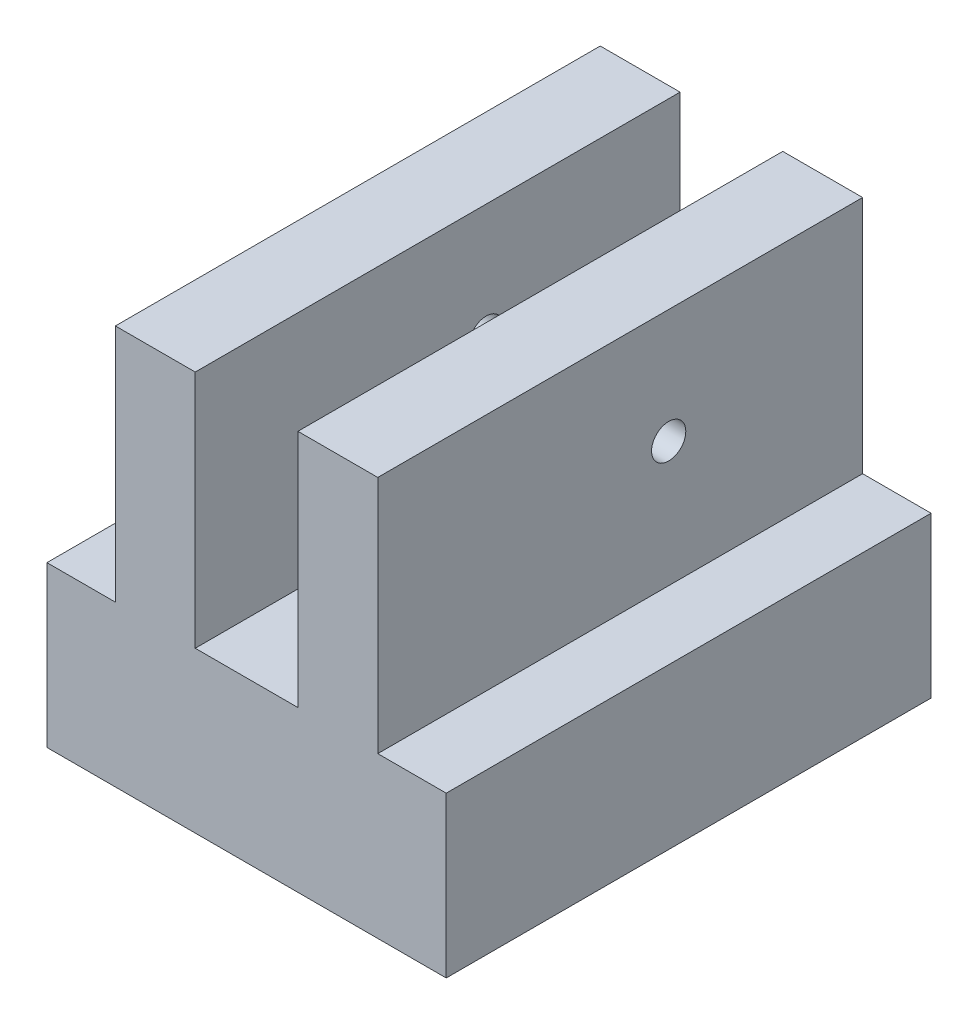
ISO-10303-21;
HEADER;
FILE_DESCRIPTION(('STEP AP214'),'2;1');
FILE_NAME('part.step','',(''),(''),'','','');
FILE_SCHEMA(('AUTOMOTIVE_DESIGN { 1 0 10303 214 1 1 1 1 }'));
ENDSEC;
DATA;
#1=APPLICATION_CONTEXT('core data for automotive mechanical design processes');
#2=APPLICATION_PROTOCOL_DEFINITION('international standard','automotive_design',2000,#1);
#3=PRODUCT_CONTEXT('',#1,'mechanical');
#4=PRODUCT('Part','Part','',(#3));
#5=PRODUCT_RELATED_PRODUCT_CATEGORY('part','',(#4));
#6=PRODUCT_DEFINITION_FORMATION('','',#4);
#7=PRODUCT_DEFINITION_CONTEXT('part definition',#1,'design');
#8=PRODUCT_DEFINITION('design','',#6,#7);
#9=PRODUCT_DEFINITION_SHAPE('','',#8);
#10=(LENGTH_UNIT() NAMED_UNIT(*) SI_UNIT(.MILLI.,.METRE.));
#11=(NAMED_UNIT(*) PLANE_ANGLE_UNIT() SI_UNIT($,.RADIAN.));
#12=(NAMED_UNIT(*) SI_UNIT($,.STERADIAN.) SOLID_ANGLE_UNIT());
#13=UNCERTAINTY_MEASURE_WITH_UNIT(LENGTH_MEASURE(1.E-05),#10,'distance_accuracy_value','');
#14=(GEOMETRIC_REPRESENTATION_CONTEXT(3) GLOBAL_UNCERTAINTY_ASSIGNED_CONTEXT((#13)) GLOBAL_UNIT_ASSIGNED_CONTEXT((#10,
#11,#12)) REPRESENTATION_CONTEXT('',''));
#15=CARTESIAN_POINT('',(0.,0.,0.));
#16=DIRECTION('',(0.,0.,1.));
#17=DIRECTION('',(1.,0.,0.));
#18=AXIS2_PLACEMENT_3D('',#15,#16,#17);
#19=CARTESIAN_POINT('',(0.,70.,0.));
#20=DIRECTION('',(0.,1.,0.));
#21=DIRECTION('',(0.,0.,1.));
#22=AXIS2_PLACEMENT_3D('',#19,#20,#21);
#23=PLANE('',#22);
#24=DIRECTION('',(0.,0.,1.));
#25=VECTOR('',#24,1.);
#26=CARTESIAN_POINT('',(-9.00000000000001,70.,0.));
#27=LINE('',#26,#25);
#28=CARTESIAN_POINT('',(-9.00000000000001,70.,-42.5));
#29=VERTEX_POINT('',#28);
#30=CARTESIAN_POINT('',(-9.00000000000001,70.,42.5));
#31=VERTEX_POINT('',#30);
#32=EDGE_CURVE('E157',#29,#31,#27,.T.);
#33=ORIENTED_EDGE('',*,*,#32,.F.);
#34=DIRECTION('',(-1.,0.,0.));
#35=VECTOR('',#34,1.);
#36=CARTESIAN_POINT('',(-35.,70.,-42.5));
#37=LINE('',#36,#35);
#38=CARTESIAN_POINT('',(-23.,70.,-42.5));
#39=VERTEX_POINT('',#38);
#40=EDGE_CURVE('E204',#29,#39,#37,.T.);
#41=ORIENTED_EDGE('',*,*,#40,.T.);
#42=DIRECTION('',(0.,0.,-1.));
#43=VECTOR('',#42,1.);
#44=CARTESIAN_POINT('',(-23.,70.,0.));
#45=LINE('',#44,#43);
#46=CARTESIAN_POINT('',(-23.,70.,42.5));
#47=VERTEX_POINT('',#46);
#48=EDGE_CURVE('E11',#47,#39,#45,.T.);
#49=ORIENTED_EDGE('',*,*,#48,.F.);
#50=DIRECTION('',(1.,0.,0.));
#51=VECTOR('',#50,1.);
#52=CARTESIAN_POINT('',(-35.,70.,42.5));
#53=LINE('',#52,#51);
#54=EDGE_CURVE('E205',#47,#31,#53,.T.);
#55=ORIENTED_EDGE('',*,*,#54,.T.);
#56=EDGE_LOOP('',(#33,#41,#49,#55));
#57=FACE_BOUND('',#56,.T.);
#58=ADVANCED_FACE('F33',(#57),#23,.T.);
#59=CARTESIAN_POINT('',(35.,50.,-8.49999999999999));
#60=DIRECTION('',(-1.,0.,0.));
#61=DIRECTION('',(0.,-1.,0.));
#62=AXIS2_PLACEMENT_3D('',#59,#60,#61);
#63=CYLINDRICAL_SURFACE('',#62,3.);
#64=CARTESIAN_POINT('',(-9.00000000000001,50.,-8.49999999999999));
#65=DIRECTION('',(-1.,0.,0.));
#66=DIRECTION('',(0.,-1.,0.));
#67=AXIS2_PLACEMENT_3D('',#64,#65,#66);
#68=CIRCLE('',#67,3.);
#69=CARTESIAN_POINT('',(-9.00000000000001,47.,-8.49999999999999));
#70=VERTEX_POINT('',#69);
#71=EDGE_CURVE('E37',#70,#70,#68,.F.);
#72=ORIENTED_EDGE('',*,*,#71,.T.);
#73=EDGE_LOOP('',(#72));
#74=FACE_BOUND('',#73,.T.);
#75=CARTESIAN_POINT('',(-23.,50.,-8.49999999999999));
#76=DIRECTION('',(-1.,0.,0.));
#77=DIRECTION('',(0.,-1.,0.));
#78=AXIS2_PLACEMENT_3D('',#75,#76,#77);
#79=CIRCLE('',#78,3.);
#80=CARTESIAN_POINT('',(-23.,47.,-8.49999999999999));
#81=VERTEX_POINT('',#80);
#82=EDGE_CURVE('E159',#81,#81,#79,.T.);
#83=ORIENTED_EDGE('',*,*,#82,.T.);
#84=EDGE_LOOP('',(#83));
#85=FACE_BOUND('',#84,.T.);
#86=ADVANCED_FACE('F244',(#74,#85),#63,.F.);
#87=CARTESIAN_POINT('',(35.,70.,-42.5));
#88=DIRECTION('',(-1.,0.,0.));
#89=DIRECTION('',(0.,0.,1.));
#90=AXIS2_PLACEMENT_3D('',#87,#88,#89);
#91=PLANE('',#90);
#92=DIRECTION('',(0.,-1.,0.));
#93=VECTOR('',#92,1.);
#94=CARTESIAN_POINT('',(35.,70.,-42.5));
#95=LINE('',#94,#93);
#96=CARTESIAN_POINT('',(35.,28.0642616694591,-42.5));
#97=VERTEX_POINT('',#96);
#98=CARTESIAN_POINT('',(35.,0.,-42.5));
#99=VERTEX_POINT('',#98);
#100=EDGE_CURVE('E225',#97,#99,#95,.T.);
#101=ORIENTED_EDGE('',*,*,#100,.F.);
#102=DIRECTION('',(0.,0.,1.));
#103=VECTOR('',#102,1.);
#104=CARTESIAN_POINT('',(35.,28.0642616694591,-42.5));
#105=LINE('',#104,#103);
#106=CARTESIAN_POINT('',(35.,28.0642616694591,42.5));
#107=VERTEX_POINT('',#106);
#108=EDGE_CURVE('E191',#97,#107,#105,.T.);
#109=ORIENTED_EDGE('',*,*,#108,.T.);
#110=DIRECTION('',(0.,-1.,0.));
#111=VECTOR('',#110,1.);
#112=CARTESIAN_POINT('',(35.,70.,42.5));
#113=LINE('',#112,#111);
#114=CARTESIAN_POINT('',(35.,0.,42.5));
#115=VERTEX_POINT('',#114);
#116=EDGE_CURVE('E208',#107,#115,#113,.T.);
#117=ORIENTED_EDGE('',*,*,#116,.T.);
#118=DIRECTION('',(0.,0.,-1.));
#119=VECTOR('',#118,1.);
#120=CARTESIAN_POINT('',(35.,0.,-42.5));
#121=LINE('',#120,#119);
#122=EDGE_CURVE('E198',#115,#99,#121,.T.);
#123=ORIENTED_EDGE('',*,*,#122,.T.);
#124=EDGE_LOOP('',(#101,#109,#117,#123));
#125=FACE_BOUND('',#124,.T.);
#126=ADVANCED_FACE('F35',(#125),#91,.F.);
#127=CARTESIAN_POINT('',(-35.,70.,-42.5));
#128=DIRECTION('',(0.,0.,1.));
#129=DIRECTION('',(1.,0.,0.));
#130=AXIS2_PLACEMENT_3D('',#127,#128,#129);
#131=PLANE('',#130);
#132=ORIENTED_EDGE('',*,*,#40,.F.);
#133=DIRECTION('',(0.,1.,0.));
#134=VECTOR('',#133,1.);
#135=CARTESIAN_POINT('',(-9.,90.8433065801214,-42.5));
#136=LINE('',#135,#134);
#137=CARTESIAN_POINT('',(-9.00000000000001,28.0642616694591,-42.5));
#138=VERTEX_POINT('',#137);
#139=EDGE_CURVE('E149',#138,#29,#136,.T.);
#140=ORIENTED_EDGE('',*,*,#139,.F.);
#141=DIRECTION('',(-1.,0.,0.));
#142=VECTOR('',#141,1.);
#143=CARTESIAN_POINT('',(8.99999999999999,28.0642616694591,-42.5));
#144=LINE('',#143,#142);
#145=CARTESIAN_POINT('',(8.99999999999999,28.0642616694591,-42.5));
#146=VERTEX_POINT('',#145);
#147=EDGE_CURVE('E146',#146,#138,#144,.T.);
#148=ORIENTED_EDGE('',*,*,#147,.F.);
#149=DIRECTION('',(0.,-1.,0.));
#150=VECTOR('',#149,1.);
#151=CARTESIAN_POINT('',(9.,90.8433065801214,-42.5));
#152=LINE('',#151,#150);
#153=CARTESIAN_POINT('',(8.99999999999999,70.,-42.5));
#154=VERTEX_POINT('',#153);
#155=EDGE_CURVE('E127',#154,#146,#152,.T.);
#156=ORIENTED_EDGE('',*,*,#155,.F.);
#157=CARTESIAN_POINT('',(23.,70.,-42.5));
#158=VERTEX_POINT('',#157);
#159=EDGE_CURVE('E201',#158,#154,#37,.T.);
#160=ORIENTED_EDGE('',*,*,#159,.F.);
#161=DIRECTION('',(0.,1.,0.));
#162=VECTOR('',#161,1.);
#163=CARTESIAN_POINT('',(23.,73.3710991092534,-42.5));
#164=LINE('',#163,#162);
#165=CARTESIAN_POINT('',(23.,28.0642616694591,-42.5));
#166=VERTEX_POINT('',#165);
#167=EDGE_CURVE('E184',#166,#158,#164,.T.);
#168=ORIENTED_EDGE('',*,*,#167,.F.);
#169=DIRECTION('',(-1.,0.,0.));
#170=VECTOR('',#169,1.);
#171=CARTESIAN_POINT('',(47.7491094384779,28.0642616694591,-42.5));
#172=LINE('',#171,#170);
#173=EDGE_CURVE('E179',#97,#166,#172,.T.);
#174=ORIENTED_EDGE('',*,*,#173,.F.);
#175=ORIENTED_EDGE('',*,*,#100,.T.);
#176=DIRECTION('',(-1.,0.,0.));
#177=VECTOR('',#176,1.);
#178=CARTESIAN_POINT('',(-35.,0.,-42.5));
#179=LINE('',#178,#177);
#180=CARTESIAN_POINT('',(-35.,0.,-42.5));
#181=VERTEX_POINT('',#180);
#182=EDGE_CURVE('E211',#99,#181,#179,.T.);
#183=ORIENTED_EDGE('',*,*,#182,.T.);
#184=DIRECTION('',(0.,-1.,0.));
#185=VECTOR('',#184,1.);
#186=CARTESIAN_POINT('',(-35.,70.,-42.5));
#187=LINE('',#186,#185);
#188=CARTESIAN_POINT('',(-35.,28.0642616694591,-42.5));
#189=VERTEX_POINT('',#188);
#190=EDGE_CURVE('E223',#189,#181,#187,.T.);
#191=ORIENTED_EDGE('',*,*,#190,.F.);
#192=DIRECTION('',(-1.,0.,0.));
#193=VECTOR('',#192,1.);
#194=CARTESIAN_POINT('',(-47.7491094384779,28.0642616694591,-42.5));
#195=LINE('',#194,#193);
#196=CARTESIAN_POINT('',(-23.,28.0642616694591,-42.5));
#197=VERTEX_POINT('',#196);
#198=EDGE_CURVE('E168',#197,#189,#195,.T.);
#199=ORIENTED_EDGE('',*,*,#198,.F.);
#200=DIRECTION('',(0.,-1.,0.));
#201=VECTOR('',#200,1.);
#202=CARTESIAN_POINT('',(-23.,73.3710991092534,-42.5));
#203=LINE('',#202,#201);
#204=EDGE_CURVE('E165',#39,#197,#203,.T.);
#205=ORIENTED_EDGE('',*,*,#204,.F.);
#206=EDGE_LOOP('',(#132,#140,#148,#156,#160,#168,#174,#175,#183,#191,#199,#205));
#207=FACE_BOUND('',#206,.T.);
#208=ADVANCED_FACE('F273',(#207),#131,.F.);
#209=CARTESIAN_POINT('',(-35.,70.,-42.5));
#210=DIRECTION('',(1.,0.,0.));
#211=DIRECTION('',(0.,0.,-1.));
#212=AXIS2_PLACEMENT_3D('',#209,#210,#211);
#213=PLANE('',#212);
#214=DIRECTION('',(0.,-1.,0.));
#215=VECTOR('',#214,1.);
#216=CARTESIAN_POINT('',(-35.,70.,42.5));
#217=LINE('',#216,#215);
#218=CARTESIAN_POINT('',(-35.,28.0642616694591,42.5));
#219=VERTEX_POINT('',#218);
#220=CARTESIAN_POINT('',(-35.,0.,42.5));
#221=VERTEX_POINT('',#220);
#222=EDGE_CURVE('E221',#219,#221,#217,.T.);
#223=ORIENTED_EDGE('',*,*,#222,.F.);
#224=DIRECTION('',(0.,0.,-1.));
#225=VECTOR('',#224,1.);
#226=CARTESIAN_POINT('',(-35.,28.0642616694591,-42.5));
#227=LINE('',#226,#225);
#228=EDGE_CURVE('E176',#219,#189,#227,.T.);
#229=ORIENTED_EDGE('',*,*,#228,.T.);
#230=ORIENTED_EDGE('',*,*,#190,.T.);
#231=DIRECTION('',(0.,0.,1.));
#232=VECTOR('',#231,1.);
#233=CARTESIAN_POINT('',(-35.,0.,-42.5));
#234=LINE('',#233,#232);
#235=EDGE_CURVE('E214',#181,#221,#234,.T.);
#236=ORIENTED_EDGE('',*,*,#235,.T.);
#237=EDGE_LOOP('',(#223,#229,#230,#236));
#238=FACE_BOUND('',#237,.T.);
#239=ADVANCED_FACE('F267',(#238),#213,.F.);
#240=CARTESIAN_POINT('',(-35.,70.,42.5));
#241=DIRECTION('',(0.,0.,-1.));
#242=DIRECTION('',(-1.,0.,0.));
#243=AXIS2_PLACEMENT_3D('',#240,#241,#242);
#244=PLANE('',#243);
#245=DIRECTION('',(-1.,0.,0.));
#246=VECTOR('',#245,1.);
#247=CARTESIAN_POINT('',(8.99999999999999,28.0642616694591,42.5));
#248=LINE('',#247,#246);
#249=CARTESIAN_POINT('',(8.99999999999999,28.0642616694591,42.5));
#250=VERTEX_POINT('',#249);
#251=CARTESIAN_POINT('',(-9.00000000000001,28.0642616694591,42.5));
#252=VERTEX_POINT('',#251);
#253=EDGE_CURVE('E132',#250,#252,#248,.T.);
#254=ORIENTED_EDGE('',*,*,#253,.T.);
#255=DIRECTION('',(0.,1.,0.));
#256=VECTOR('',#255,1.);
#257=CARTESIAN_POINT('',(-9.,90.8433065801214,42.5));
#258=LINE('',#257,#256);
#259=EDGE_CURVE('E144',#252,#31,#258,.T.);
#260=ORIENTED_EDGE('',*,*,#259,.T.);
#261=ORIENTED_EDGE('',*,*,#54,.F.);
#262=DIRECTION('',(0.,-1.,0.));
#263=VECTOR('',#262,1.);
#264=CARTESIAN_POINT('',(-23.,73.3710991092534,42.5));
#265=LINE('',#264,#263);
#266=CARTESIAN_POINT('',(-23.,28.0642616694591,42.5));
#267=VERTEX_POINT('',#266);
#268=EDGE_CURVE('E57',#47,#267,#265,.T.);
#269=ORIENTED_EDGE('',*,*,#268,.T.);
#270=DIRECTION('',(-1.,0.,0.));
#271=VECTOR('',#270,1.);
#272=CARTESIAN_POINT('',(-47.7491094384779,28.0642616694591,42.5));
#273=LINE('',#272,#271);
#274=EDGE_CURVE('E167',#267,#219,#273,.T.);
#275=ORIENTED_EDGE('',*,*,#274,.T.);
#276=ORIENTED_EDGE('',*,*,#222,.T.);
#277=DIRECTION('',(1.,0.,0.));
#278=VECTOR('',#277,1.);
#279=CARTESIAN_POINT('',(-35.,0.,42.5));
#280=LINE('',#279,#278);
#281=EDGE_CURVE('E217',#221,#115,#280,.T.);
#282=ORIENTED_EDGE('',*,*,#281,.T.);
#283=ORIENTED_EDGE('',*,*,#116,.F.);
#284=DIRECTION('',(-1.,0.,0.));
#285=VECTOR('',#284,1.);
#286=CARTESIAN_POINT('',(47.7491094384779,28.0642616694591,42.5));
#287=LINE('',#286,#285);
#288=CARTESIAN_POINT('',(23.,28.0642616694591,42.5));
#289=VERTEX_POINT('',#288);
#290=EDGE_CURVE('E180',#107,#289,#287,.T.);
#291=ORIENTED_EDGE('',*,*,#290,.T.);
#292=DIRECTION('',(0.,1.,0.));
#293=VECTOR('',#292,1.);
#294=CARTESIAN_POINT('',(23.,73.3710991092534,42.5));
#295=LINE('',#294,#293);
#296=CARTESIAN_POINT('',(23.,70.,42.5));
#297=VERTEX_POINT('',#296);
#298=EDGE_CURVE('E183',#289,#297,#295,.T.);
#299=ORIENTED_EDGE('',*,*,#298,.T.);
#300=CARTESIAN_POINT('',(8.99999999999999,70.,42.5));
#301=VERTEX_POINT('',#300);
#302=EDGE_CURVE('E143',#301,#297,#53,.T.);
#303=ORIENTED_EDGE('',*,*,#302,.F.);
#304=DIRECTION('',(0.,-1.,0.));
#305=VECTOR('',#304,1.);
#306=CARTESIAN_POINT('',(9.,90.8433065801214,42.5));
#307=LINE('',#306,#305);
#308=EDGE_CURVE('E50',#301,#250,#307,.T.);
#309=ORIENTED_EDGE('',*,*,#308,.T.);
#310=EDGE_LOOP('',(#254,#260,#261,#269,#275,#276,#282,#283,#291,#299,#303,#309));
#311=FACE_BOUND('',#310,.T.);
#312=ADVANCED_FACE('F141',(#311),#244,.F.);
#313=DIRECTION('',(0.,0.,-1.));
#314=VECTOR('',#313,1.);
#315=CARTESIAN_POINT('',(8.99999999999999,70.,0.));
#316=LINE('',#315,#314);
#317=EDGE_CURVE('E155',#301,#154,#316,.T.);
#318=ORIENTED_EDGE('',*,*,#317,.F.);
#319=ORIENTED_EDGE('',*,*,#302,.T.);
#320=DIRECTION('',(0.,0.,1.));
#321=VECTOR('',#320,1.);
#322=CARTESIAN_POINT('',(23.,70.,0.));
#323=LINE('',#322,#321);
#324=EDGE_CURVE('E42',#158,#297,#323,.T.);
#325=ORIENTED_EDGE('',*,*,#324,.F.);
#326=ORIENTED_EDGE('',*,*,#159,.T.);
#327=EDGE_LOOP('',(#318,#319,#325,#326));
#328=FACE_BOUND('',#327,.T.);
#329=ADVANCED_FACE('F247',(#328),#23,.T.);
#330=CARTESIAN_POINT('',(0.,0.,0.));
#331=DIRECTION('',(0.,1.,0.));
#332=DIRECTION('',(0.,0.,1.));
#333=AXIS2_PLACEMENT_3D('',#330,#331,#332);
#334=PLANE('',#333);
#335=CARTESIAN_POINT('',(0.,0.,0.));
#336=DIRECTION('',(0.,-1.,0.));
#337=DIRECTION('',(0.,0.,-1.));
#338=AXIS2_PLACEMENT_3D('',#335,#336,#337);
#339=CIRCLE('',#338,5.);
#340=CARTESIAN_POINT('',(0.,0.,-5.));
#341=VERTEX_POINT('',#340);
#342=EDGE_CURVE('E194',#341,#341,#339,.T.);
#343=ORIENTED_EDGE('',*,*,#342,.F.);
#344=EDGE_LOOP('',(#343));
#345=FACE_BOUND('',#344,.T.);
#346=ORIENTED_EDGE('',*,*,#122,.F.);
#347=ORIENTED_EDGE('',*,*,#281,.F.);
#348=ORIENTED_EDGE('',*,*,#235,.F.);
#349=ORIENTED_EDGE('',*,*,#182,.F.);
#350=EDGE_LOOP('',(#346,#347,#348,#349));
#351=FACE_BOUND('',#350,.T.);
#352=ADVANCED_FACE('F258',(#345,#351),#334,.F.);
#353=CARTESIAN_POINT('',(0.,20.,0.));
#354=DIRECTION('',(0.,-1.,0.));
#355=DIRECTION('',(0.,0.,-1.));
#356=AXIS2_PLACEMENT_3D('',#353,#354,#355);
#357=CYLINDRICAL_SURFACE('',#356,5.);
#358=CARTESIAN_POINT('',(0.,20.,0.));
#359=DIRECTION('',(0.,-1.,0.));
#360=DIRECTION('',(0.,0.,-1.));
#361=AXIS2_PLACEMENT_3D('',#358,#359,#360);
#362=CIRCLE('',#361,5.);
#363=CARTESIAN_POINT('',(0.,20.,-5.));
#364=VERTEX_POINT('',#363);
#365=EDGE_CURVE('E195',#364,#364,#362,.T.);
#366=ORIENTED_EDGE('',*,*,#365,.F.);
#367=EDGE_LOOP('',(#366));
#368=FACE_BOUND('',#367,.T.);
#369=ORIENTED_EDGE('',*,*,#342,.T.);
#370=EDGE_LOOP('',(#369));
#371=FACE_BOUND('',#370,.T.);
#372=ADVANCED_FACE('F265',(#368,#371),#357,.F.);
#373=CARTESIAN_POINT('',(0.,20.,0.));
#374=DIRECTION('',(0.,-1.,0.));
#375=DIRECTION('',(0.,0.,-1.));
#376=AXIS2_PLACEMENT_3D('',#373,#374,#375);
#377=PLANE('',#376);
#378=ORIENTED_EDGE('',*,*,#365,.T.);
#379=EDGE_LOOP('',(#378));
#380=FACE_BOUND('',#379,.T.);
#381=ADVANCED_FACE('F309',(#380),#377,.T.);
#382=CARTESIAN_POINT('',(47.7491094384779,28.0642616694591,42.5));
#383=DIRECTION('',(0.,-1.,0.));
#384=DIRECTION('',(0.,0.,-1.));
#385=AXIS2_PLACEMENT_3D('',#382,#383,#384);
#386=PLANE('',#385);
#387=ORIENTED_EDGE('',*,*,#173,.T.);
#388=DIRECTION('',(0.,0.,-1.));
#389=VECTOR('',#388,1.);
#390=CARTESIAN_POINT('',(23.,28.0642616694591,42.5));
#391=LINE('',#390,#389);
#392=EDGE_CURVE('E186',#289,#166,#391,.T.);
#393=ORIENTED_EDGE('',*,*,#392,.F.);
#394=ORIENTED_EDGE('',*,*,#290,.F.);
#395=ORIENTED_EDGE('',*,*,#108,.F.);
#396=EDGE_LOOP('',(#387,#393,#394,#395));
#397=FACE_BOUND('',#396,.T.);
#398=ADVANCED_FACE('F294',(#397),#386,.F.);
#399=CARTESIAN_POINT('',(23.,73.3710991092534,42.5));
#400=DIRECTION('',(-1.,0.,0.));
#401=DIRECTION('',(0.,-1.,0.));
#402=AXIS2_PLACEMENT_3D('',#399,#400,#401);
#403=PLANE('',#402);
#404=CARTESIAN_POINT('',(23.,50.,-8.49999999999999));
#405=DIRECTION('',(-1.,0.,0.));
#406=DIRECTION('',(0.,-1.,0.));
#407=AXIS2_PLACEMENT_3D('',#404,#405,#406);
#408=CIRCLE('',#407,3.);
#409=CARTESIAN_POINT('',(23.,47.,-8.49999999999999));
#410=VERTEX_POINT('',#409);
#411=EDGE_CURVE('E162',#410,#410,#408,.T.);
#412=ORIENTED_EDGE('',*,*,#411,.T.);
#413=EDGE_LOOP('',(#412));
#414=FACE_BOUND('',#413,.T.);
#415=ORIENTED_EDGE('',*,*,#324,.T.);
#416=ORIENTED_EDGE('',*,*,#298,.F.);
#417=ORIENTED_EDGE('',*,*,#392,.T.);
#418=ORIENTED_EDGE('',*,*,#167,.T.);
#419=EDGE_LOOP('',(#415,#416,#417,#418));
#420=FACE_BOUND('',#419,.T.);
#421=ADVANCED_FACE('F296',(#414,#420),#403,.F.);
#422=CARTESIAN_POINT('',(-47.7491094384779,28.0642616694591,42.5));
#423=DIRECTION('',(0.,-1.,0.));
#424=DIRECTION('',(1.,0.,0.));
#425=AXIS2_PLACEMENT_3D('',#422,#423,#424);
#426=PLANE('',#425);
#427=ORIENTED_EDGE('',*,*,#274,.F.);
#428=DIRECTION('',(0.,0.,-1.));
#429=VECTOR('',#428,1.);
#430=CARTESIAN_POINT('',(-23.,28.0642616694591,42.5));
#431=LINE('',#430,#429);
#432=EDGE_CURVE('E171',#267,#197,#431,.T.);
#433=ORIENTED_EDGE('',*,*,#432,.T.);
#434=ORIENTED_EDGE('',*,*,#198,.T.);
#435=ORIENTED_EDGE('',*,*,#228,.F.);
#436=EDGE_LOOP('',(#427,#433,#434,#435));
#437=FACE_BOUND('',#436,.T.);
#438=ADVANCED_FACE('F299',(#437),#426,.F.);
#439=CARTESIAN_POINT('',(-23.,73.3710991092534,42.5));
#440=DIRECTION('',(1.,0.,0.));
#441=DIRECTION('',(0.,1.,0.));
#442=AXIS2_PLACEMENT_3D('',#439,#440,#441);
#443=PLANE('',#442);
#444=ORIENTED_EDGE('',*,*,#82,.F.);
#445=EDGE_LOOP('',(#444));
#446=FACE_BOUND('',#445,.T.);
#447=ORIENTED_EDGE('',*,*,#48,.T.);
#448=ORIENTED_EDGE('',*,*,#204,.T.);
#449=ORIENTED_EDGE('',*,*,#432,.F.);
#450=ORIENTED_EDGE('',*,*,#268,.F.);
#451=EDGE_LOOP('',(#447,#448,#449,#450));
#452=FACE_BOUND('',#451,.T.);
#453=ADVANCED_FACE('F306',(#446,#452),#443,.F.);
#454=CARTESIAN_POINT('',(8.99999999999999,50.,-8.49999999999999));
#455=DIRECTION('',(1.,0.,0.));
#456=DIRECTION('',(0.,1.,0.));
#457=AXIS2_PLACEMENT_3D('',#454,#455,#456);
#458=CIRCLE('',#457,3.);
#459=CARTESIAN_POINT('',(8.99999999999999,53.,-8.49999999999999));
#460=VERTEX_POINT('',#459);
#461=EDGE_CURVE('E153',#460,#460,#458,.F.);
#462=ORIENTED_EDGE('',*,*,#461,.T.);
#463=EDGE_LOOP('',(#462));
#464=FACE_BOUND('',#463,.T.);
#465=ORIENTED_EDGE('',*,*,#411,.F.);
#466=EDGE_LOOP('',(#465));
#467=FACE_BOUND('',#466,.T.);
#468=ADVANCED_FACE('F231',(#464,#467),#63,.F.);
#469=CARTESIAN_POINT('',(-9.,90.8433065801214,42.5));
#470=DIRECTION('',(-1.,0.,0.));
#471=DIRECTION('',(0.,-1.,0.));
#472=AXIS2_PLACEMENT_3D('',#469,#470,#471);
#473=PLANE('',#472);
#474=ORIENTED_EDGE('',*,*,#32,.T.);
#475=ORIENTED_EDGE('',*,*,#259,.F.);
#476=DIRECTION('',(0.,0.,-1.));
#477=VECTOR('',#476,1.);
#478=CARTESIAN_POINT('',(-9.00000000000001,28.0642616694591,42.5));
#479=LINE('',#478,#477);
#480=EDGE_CURVE('E131',#252,#138,#479,.T.);
#481=ORIENTED_EDGE('',*,*,#480,.T.);
#482=ORIENTED_EDGE('',*,*,#139,.T.);
#483=EDGE_LOOP('',(#474,#475,#481,#482));
#484=FACE_BOUND('',#483,.T.);
#485=ORIENTED_EDGE('',*,*,#71,.F.);
#486=EDGE_LOOP('',(#485));
#487=FACE_BOUND('',#486,.T.);
#488=ADVANCED_FACE('F234',(#484,#487),#473,.F.);
#489=CARTESIAN_POINT('',(9.,90.8433065801214,42.5));
#490=DIRECTION('',(1.,0.,0.));
#491=DIRECTION('',(0.,1.,0.));
#492=AXIS2_PLACEMENT_3D('',#489,#490,#491);
#493=PLANE('',#492);
#494=ORIENTED_EDGE('',*,*,#317,.T.);
#495=ORIENTED_EDGE('',*,*,#155,.T.);
#496=DIRECTION('',(0.,0.,-1.));
#497=VECTOR('',#496,1.);
#498=CARTESIAN_POINT('',(8.99999999999999,28.0642616694591,42.5));
#499=LINE('',#498,#497);
#500=EDGE_CURVE('E122',#250,#146,#499,.T.);
#501=ORIENTED_EDGE('',*,*,#500,.F.);
#502=ORIENTED_EDGE('',*,*,#308,.F.);
#503=EDGE_LOOP('',(#494,#495,#501,#502));
#504=FACE_BOUND('',#503,.T.);
#505=ORIENTED_EDGE('',*,*,#461,.F.);
#506=EDGE_LOOP('',(#505));
#507=FACE_BOUND('',#506,.T.);
#508=ADVANCED_FACE('F124',(#504,#507),#493,.F.);
#509=CARTESIAN_POINT('',(8.99999999999999,28.0642616694591,42.5));
#510=DIRECTION('',(0.,-1.,0.));
#511=DIRECTION('',(1.,0.,0.));
#512=AXIS2_PLACEMENT_3D('',#509,#510,#511);
#513=PLANE('',#512);
#514=ORIENTED_EDGE('',*,*,#147,.T.);
#515=ORIENTED_EDGE('',*,*,#480,.F.);
#516=ORIENTED_EDGE('',*,*,#253,.F.);
#517=ORIENTED_EDGE('',*,*,#500,.T.);
#518=EDGE_LOOP('',(#514,#515,#516,#517));
#519=FACE_BOUND('',#518,.T.);
#520=ADVANCED_FACE('F135',(#519),#513,.F.);
#521=CLOSED_SHELL('',(#58,#86,#126,#208,#239,#312,#329,#352,#372,#381,#398,#421,#438,#453,#468,
#488,#508,#520));
#522=MANIFOLD_SOLID_BREP('B2',#521);
#523=ADVANCED_BREP_SHAPE_REPRESENTATION('',(#18,#522),#14);
#524=SHAPE_DEFINITION_REPRESENTATION(#9,#523);
ENDSEC;
END-ISO-10303-21;
